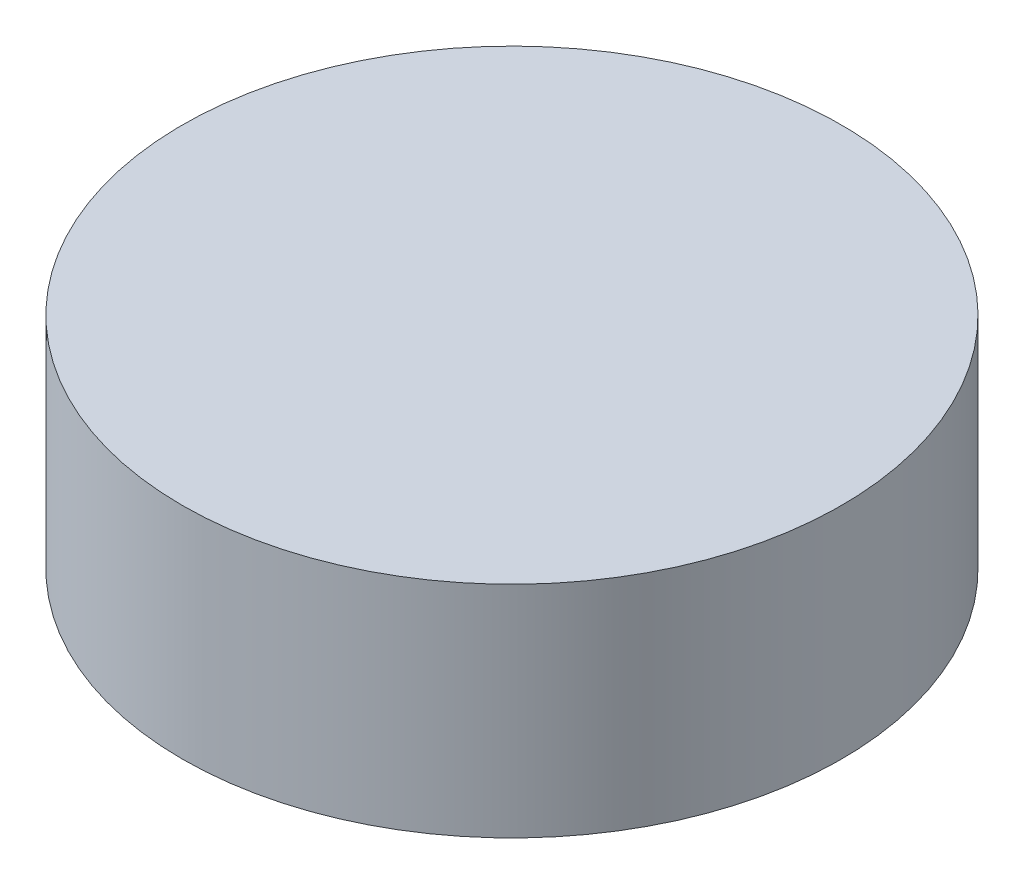
ISO-10303-21;
HEADER;
FILE_DESCRIPTION(('STEP AP214'),'2;1');
FILE_NAME('part.step','',(''),(''),'','','');
FILE_SCHEMA(('AUTOMOTIVE_DESIGN { 1 0 10303 214 1 1 1 1 }'));
ENDSEC;
DATA;
#1=APPLICATION_CONTEXT('core data for automotive mechanical design processes');
#2=APPLICATION_PROTOCOL_DEFINITION('international standard','automotive_design',2000,#1);
#3=PRODUCT_CONTEXT('',#1,'mechanical');
#4=PRODUCT('Part','Part','',(#3));
#5=PRODUCT_RELATED_PRODUCT_CATEGORY('part','',(#4));
#6=PRODUCT_DEFINITION_FORMATION('','',#4);
#7=PRODUCT_DEFINITION_CONTEXT('part definition',#1,'design');
#8=PRODUCT_DEFINITION('design','',#6,#7);
#9=PRODUCT_DEFINITION_SHAPE('','',#8);
#10=(LENGTH_UNIT() NAMED_UNIT(*) SI_UNIT(.MILLI.,.METRE.));
#11=(NAMED_UNIT(*) PLANE_ANGLE_UNIT() SI_UNIT($,.RADIAN.));
#12=(NAMED_UNIT(*) SI_UNIT($,.STERADIAN.) SOLID_ANGLE_UNIT());
#13=UNCERTAINTY_MEASURE_WITH_UNIT(LENGTH_MEASURE(1.E-05),#10,'distance_accuracy_value','');
#14=(GEOMETRIC_REPRESENTATION_CONTEXT(3) GLOBAL_UNCERTAINTY_ASSIGNED_CONTEXT((#13)) GLOBAL_UNIT_ASSIGNED_CONTEXT((#10,
#11,#12)) REPRESENTATION_CONTEXT('',''));
#15=CARTESIAN_POINT('',(0.,0.,0.));
#16=DIRECTION('',(0.,0.,1.));
#17=DIRECTION('',(1.,0.,0.));
#18=AXIS2_PLACEMENT_3D('',#15,#16,#17);
#19=CARTESIAN_POINT('',(0.,1.,0.));
#20=DIRECTION('',(0.,-1.,0.));
#21=DIRECTION('',(0.,0.,-1.));
#22=AXIS2_PLACEMENT_3D('',#19,#20,#21);
#23=CYLINDRICAL_SURFACE('',#22,1.5);
#24=CARTESIAN_POINT('',(0.,1.,0.));
#25=DIRECTION('',(0.,1.,0.));
#26=DIRECTION('',(0.,0.,1.));
#27=AXIS2_PLACEMENT_3D('',#24,#25,#26);
#28=CIRCLE('',#27,1.5);
#29=CARTESIAN_POINT('',(0.,1.,1.5));
#30=VERTEX_POINT('',#29);
#31=EDGE_CURVE('E10',#30,#30,#28,.T.);
#32=ORIENTED_EDGE('',*,*,#31,.F.);
#33=EDGE_LOOP('',(#32));
#34=FACE_BOUND('',#33,.T.);
#35=CARTESIAN_POINT('',(0.,0.,0.));
#36=DIRECTION('',(0.,1.,0.));
#37=DIRECTION('',(0.,0.,1.));
#38=AXIS2_PLACEMENT_3D('',#35,#36,#37);
#39=CIRCLE('',#38,1.5);
#40=CARTESIAN_POINT('',(0.,0.,1.5));
#41=VERTEX_POINT('',#40);
#42=EDGE_CURVE('E36',#41,#41,#39,.T.);
#43=ORIENTED_EDGE('',*,*,#42,.T.);
#44=EDGE_LOOP('',(#43));
#45=FACE_BOUND('',#44,.T.);
#46=ADVANCED_FACE('F33',(#34,#45),#23,.T.);
#47=CARTESIAN_POINT('',(0.,1.,0.));
#48=DIRECTION('',(0.,1.,0.));
#49=DIRECTION('',(0.,0.,1.));
#50=AXIS2_PLACEMENT_3D('',#47,#48,#49);
#51=PLANE('',#50);
#52=ORIENTED_EDGE('',*,*,#31,.T.);
#53=EDGE_LOOP('',(#52));
#54=FACE_BOUND('',#53,.T.);
#55=ADVANCED_FACE('F48',(#54),#51,.T.);
#56=CARTESIAN_POINT('',(0.,0.,0.));
#57=DIRECTION('',(0.,1.,0.));
#58=DIRECTION('',(0.,0.,1.));
#59=AXIS2_PLACEMENT_3D('',#56,#57,#58);
#60=PLANE('',#59);
#61=ORIENTED_EDGE('',*,*,#42,.F.);
#62=EDGE_LOOP('',(#61));
#63=FACE_BOUND('',#62,.T.);
#64=ADVANCED_FACE('F46',(#63),#60,.F.);
#65=CLOSED_SHELL('',(#46,#55,#64));
#66=MANIFOLD_SOLID_BREP('B2',#65);
#67=ADVANCED_BREP_SHAPE_REPRESENTATION('',(#18,#66),#14);
#68=SHAPE_DEFINITION_REPRESENTATION(#9,#67);
ENDSEC;
END-ISO-10303-21;
